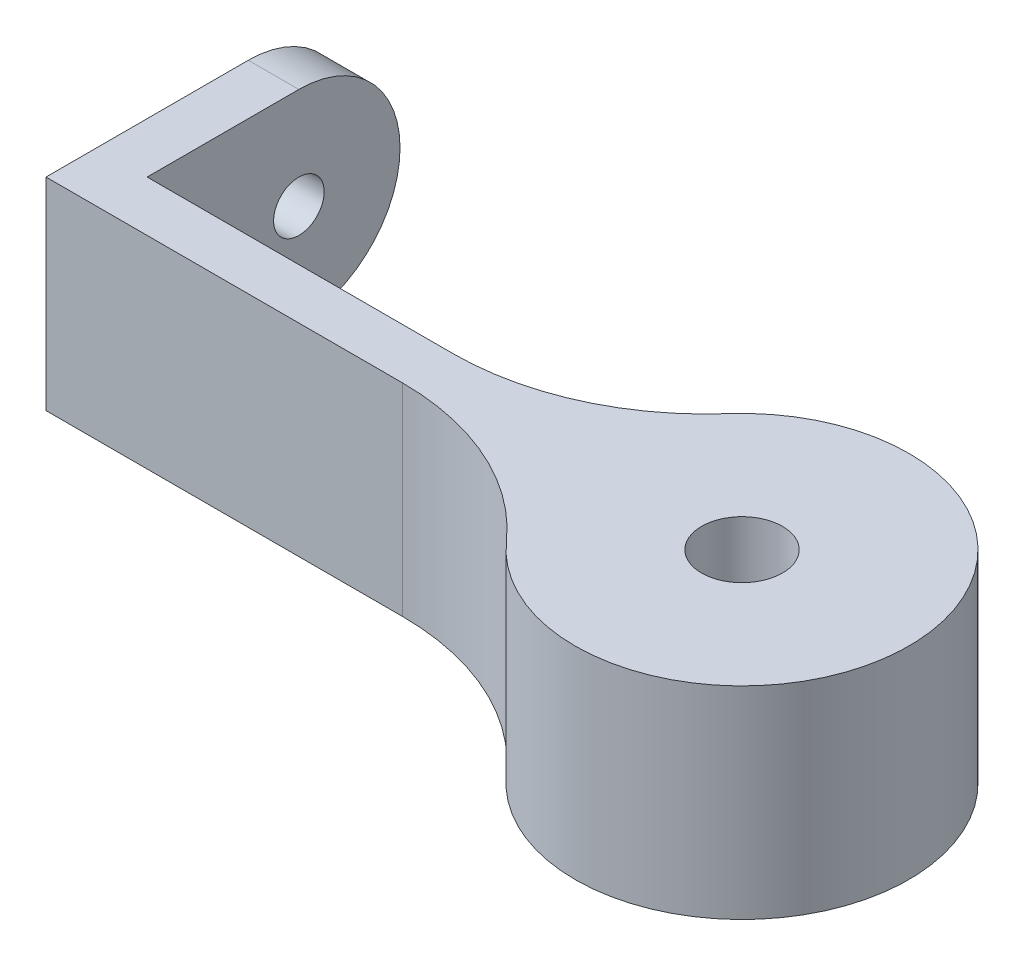
ISO-10303-21;
HEADER;
FILE_DESCRIPTION(('STEP AP214'),'2;1');
FILE_NAME('part.step','',(''),(''),'','','');
FILE_SCHEMA(('AUTOMOTIVE_DESIGN { 1 0 10303 214 1 1 1 1 }'));
ENDSEC;
DATA;
#1=APPLICATION_CONTEXT('core data for automotive mechanical design processes');
#2=APPLICATION_PROTOCOL_DEFINITION('international standard','automotive_design',2000,#1);
#3=PRODUCT_CONTEXT('',#1,'mechanical');
#4=PRODUCT('Part','Part','',(#3));
#5=PRODUCT_RELATED_PRODUCT_CATEGORY('part','',(#4));
#6=PRODUCT_DEFINITION_FORMATION('','',#4);
#7=PRODUCT_DEFINITION_CONTEXT('part definition',#1,'design');
#8=PRODUCT_DEFINITION('design','',#6,#7);
#9=PRODUCT_DEFINITION_SHAPE('','',#8);
#10=(LENGTH_UNIT() NAMED_UNIT(*) SI_UNIT(.MILLI.,.METRE.));
#11=(NAMED_UNIT(*) PLANE_ANGLE_UNIT() SI_UNIT($,.RADIAN.));
#12=(NAMED_UNIT(*) SI_UNIT($,.STERADIAN.) SOLID_ANGLE_UNIT());
#13=UNCERTAINTY_MEASURE_WITH_UNIT(LENGTH_MEASURE(1.E-05),#10,'distance_accuracy_value','');
#14=(GEOMETRIC_REPRESENTATION_CONTEXT(3) GLOBAL_UNCERTAINTY_ASSIGNED_CONTEXT((#13)) GLOBAL_UNIT_ASSIGNED_CONTEXT((#10,
#11,#12)) REPRESENTATION_CONTEXT('',''));
#15=CARTESIAN_POINT('',(0.,0.,0.));
#16=DIRECTION('',(0.,0.,1.));
#17=DIRECTION('',(1.,0.,0.));
#18=AXIS2_PLACEMENT_3D('',#15,#16,#17);
#19=CARTESIAN_POINT('',(-26.52380257212,8.,0.));
#20=DIRECTION('',(1.,0.,0.));
#21=DIRECTION('',(0.,0.,1.));
#22=AXIS2_PLACEMENT_3D('',#19,#20,#21);
#23=PLANE('',#22);
#24=CARTESIAN_POINT('',(-26.52380257212,4.,-7.));
#25=DIRECTION('',(1.,0.,0.));
#26=DIRECTION('',(0.,0.,-1.));
#27=AXIS2_PLACEMENT_3D('',#24,#25,#26);
#28=CIRCLE('',#27,1.);
#29=CARTESIAN_POINT('',(-26.52380257212,4.,-8.));
#30=VERTEX_POINT('',#29);
#31=EDGE_CURVE('E122',#30,#30,#28,.T.);
#32=ORIENTED_EDGE('',*,*,#31,.T.);
#33=EDGE_LOOP('',(#32));
#34=FACE_BOUND('',#33,.T.);
#35=DIRECTION('',(0.,0.,-1.));
#36=VECTOR('',#35,1.);
#37=CARTESIAN_POINT('',(-26.52380257212,0.,0.));
#38=LINE('',#37,#36);
#39=CARTESIAN_POINT('',(-26.52380257212,0.,0.999999999999998));
#40=VERTEX_POINT('',#39);
#41=CARTESIAN_POINT('',(-26.52380257212,0.,-7.));
#42=VERTEX_POINT('',#41);
#43=EDGE_CURVE('E119',#40,#42,#38,.T.);
#44=ORIENTED_EDGE('',*,*,#43,.F.);
#45=DIRECTION('',(0.,-1.,0.));
#46=VECTOR('',#45,1.);
#47=CARTESIAN_POINT('',(-26.52380257212,8.,0.999999999999998));
#48=LINE('',#47,#46);
#49=CARTESIAN_POINT('',(-26.52380257212,8.,0.999999999999998));
#50=VERTEX_POINT('',#49);
#51=EDGE_CURVE('E138',#50,#40,#48,.T.);
#52=ORIENTED_EDGE('',*,*,#51,.F.);
#53=DIRECTION('',(0.,0.,-1.));
#54=VECTOR('',#53,1.);
#55=CARTESIAN_POINT('',(-26.52380257212,8.,0.));
#56=LINE('',#55,#54);
#57=CARTESIAN_POINT('',(-26.52380257212,8.,-7.));
#58=VERTEX_POINT('',#57);
#59=EDGE_CURVE('E121',#50,#58,#56,.T.);
#60=ORIENTED_EDGE('',*,*,#59,.T.);
#61=CARTESIAN_POINT('',(-26.52380257212,4.,-7.));
#62=DIRECTION('',(1.,0.,0.));
#63=DIRECTION('',(0.,0.,-1.));
#64=AXIS2_PLACEMENT_3D('',#61,#62,#63);
#65=CIRCLE('',#64,4.);
#66=EDGE_CURVE('E108',#42,#58,#65,.T.);
#67=ORIENTED_EDGE('',*,*,#66,.F.);
#68=EDGE_LOOP('',(#44,#52,#60,#67));
#69=FACE_BOUND('',#68,.T.);
#70=ADVANCED_FACE('F43',(#34,#69),#23,.F.);
#71=CARTESIAN_POINT('',(-24.52380257212,8.,-1.));
#72=DIRECTION('',(1.,0.,0.));
#73=DIRECTION('',(0.,0.,1.));
#74=AXIS2_PLACEMENT_3D('',#71,#72,#73);
#75=PLANE('',#74);
#76=CARTESIAN_POINT('',(-24.52380257212,4.,-7.));
#77=DIRECTION('',(-1.,0.,0.));
#78=DIRECTION('',(0.,0.,1.));
#79=AXIS2_PLACEMENT_3D('',#76,#77,#78);
#80=CIRCLE('',#79,1.);
#81=CARTESIAN_POINT('',(-24.52380257212,4.,-8.));
#82=VERTEX_POINT('',#81);
#83=EDGE_CURVE('E151',#82,#82,#80,.F.);
#84=ORIENTED_EDGE('',*,*,#83,.F.);
#85=EDGE_LOOP('',(#84));
#86=FACE_BOUND('',#85,.T.);
#87=CARTESIAN_POINT('',(-24.52380257212,4.,-7.));
#88=DIRECTION('',(-1.,0.,0.));
#89=DIRECTION('',(0.,0.,1.));
#90=AXIS2_PLACEMENT_3D('',#87,#88,#89);
#91=CIRCLE('',#90,4.);
#92=CARTESIAN_POINT('',(-24.52380257212,0.,-7.));
#93=VERTEX_POINT('',#92);
#94=CARTESIAN_POINT('',(-24.52380257212,8.,-7.));
#95=VERTEX_POINT('',#94);
#96=EDGE_CURVE('E111',#93,#95,#91,.F.);
#97=ORIENTED_EDGE('',*,*,#96,.T.);
#98=DIRECTION('',(0.,0.,-1.));
#99=VECTOR('',#98,1.);
#100=CARTESIAN_POINT('',(-24.52380257212,8.,-1.));
#101=LINE('',#100,#99);
#102=CARTESIAN_POINT('',(-24.52380257212,8.,-1.));
#103=VERTEX_POINT('',#102);
#104=EDGE_CURVE('E145',#103,#95,#101,.T.);
#105=ORIENTED_EDGE('',*,*,#104,.F.);
#106=DIRECTION('',(0.,-1.,0.));
#107=VECTOR('',#106,1.);
#108=CARTESIAN_POINT('',(-24.52380257212,8.,-1.));
#109=LINE('',#108,#107);
#110=CARTESIAN_POINT('',(-24.52380257212,0.,-1.));
#111=VERTEX_POINT('',#110);
#112=EDGE_CURVE('E140',#103,#111,#109,.T.);
#113=ORIENTED_EDGE('',*,*,#112,.T.);
#114=DIRECTION('',(0.,0.,-1.));
#115=VECTOR('',#114,1.);
#116=CARTESIAN_POINT('',(-24.52380257212,0.,-1.));
#117=LINE('',#116,#115);
#118=EDGE_CURVE('E149',#111,#93,#117,.T.);
#119=ORIENTED_EDGE('',*,*,#118,.T.);
#120=EDGE_LOOP('',(#97,#105,#113,#119));
#121=FACE_BOUND('',#120,.T.);
#122=ADVANCED_FACE('F202',(#86,#121),#75,.T.);
#123=CARTESIAN_POINT('',(0.,8.,0.));
#124=DIRECTION('',(0.,-1.,0.));
#125=DIRECTION('',(0.,0.,1.));
#126=AXIS2_PLACEMENT_3D('',#123,#124,#125);
#127=CYLINDRICAL_SURFACE('',#126,6.6);
#128=CARTESIAN_POINT('',(0.,8.,0.));
#129=DIRECTION('',(0.,-1.,0.));
#130=DIRECTION('',(0.,0.,-1.));
#131=AXIS2_PLACEMENT_3D('',#128,#129,#130);
#132=CIRCLE('',#131,6.6);
#133=CARTESIAN_POINT('',(-4.94292933822999,8.,-4.37349397590361));
#134=VERTEX_POINT('',#133);
#135=CARTESIAN_POINT('',(-4.94292933822999,8.,4.37349397590361));
#136=VERTEX_POINT('',#135);
#137=EDGE_CURVE('E171',#134,#136,#132,.T.);
#138=ORIENTED_EDGE('',*,*,#137,.T.);
#139=DIRECTION('',(0.,-1.,0.));
#140=VECTOR('',#139,1.);
#141=CARTESIAN_POINT('',(-4.94292933822999,8.,4.37349397590361));
#142=LINE('',#141,#140);
#143=CARTESIAN_POINT('',(-4.94292933822999,0.,4.37349397590361));
#144=VERTEX_POINT('',#143);
#145=EDGE_CURVE('E144',#144,#136,#142,.F.);
#146=ORIENTED_EDGE('',*,*,#145,.F.);
#147=CARTESIAN_POINT('',(0.,0.,0.));
#148=DIRECTION('',(0.,-1.,0.));
#149=DIRECTION('',(0.,0.,-1.));
#150=AXIS2_PLACEMENT_3D('',#147,#148,#149);
#151=CIRCLE('',#150,6.6);
#152=CARTESIAN_POINT('',(-4.94292933822999,0.,-4.37349397590361));
#153=VERTEX_POINT('',#152);
#154=EDGE_CURVE('E134',#153,#144,#151,.T.);
#155=ORIENTED_EDGE('',*,*,#154,.F.);
#156=DIRECTION('',(0.,-1.,0.));
#157=VECTOR('',#156,1.);
#158=CARTESIAN_POINT('',(-4.94292933822999,8.,-4.37349397590361));
#159=LINE('',#158,#157);
#160=EDGE_CURVE('E153',#134,#153,#159,.T.);
#161=ORIENTED_EDGE('',*,*,#160,.F.);
#162=EDGE_LOOP('',(#138,#146,#155,#161));
#163=FACE_BOUND('',#162,.T.);
#164=ADVANCED_FACE('F169',(#163),#127,.T.);
#165=CARTESIAN_POINT('',(0.,8.,0.999999999999998));
#166=DIRECTION('',(0.,0.,1.));
#167=DIRECTION('',(-1.,0.,0.));
#168=AXIS2_PLACEMENT_3D('',#165,#166,#167);
#169=PLANE('',#168);
#170=DIRECTION('',(1.,0.,0.));
#171=VECTOR('',#170,1.);
#172=CARTESIAN_POINT('',(0.,8.,0.999999999999998));
#173=LINE('',#172,#171);
#174=CARTESIAN_POINT('',(-12.432216214336,8.,0.999999999999998));
#175=VERTEX_POINT('',#174);
#176=EDGE_CURVE('E173',#50,#175,#173,.T.);
#177=ORIENTED_EDGE('',*,*,#176,.F.);
#178=ORIENTED_EDGE('',*,*,#51,.T.);
#179=DIRECTION('',(1.,0.,0.));
#180=VECTOR('',#179,1.);
#181=CARTESIAN_POINT('',(0.,0.,0.999999999999998));
#182=LINE('',#181,#180);
#183=CARTESIAN_POINT('',(-12.432216214336,0.,0.999999999999998));
#184=VERTEX_POINT('',#183);
#185=EDGE_CURVE('E127',#40,#184,#182,.T.);
#186=ORIENTED_EDGE('',*,*,#185,.T.);
#187=DIRECTION('',(0.,-1.,0.));
#188=VECTOR('',#187,1.);
#189=CARTESIAN_POINT('',(-12.432216214336,8.,0.999999999999998));
#190=LINE('',#189,#188);
#191=EDGE_CURVE('E159',#175,#184,#190,.T.);
#192=ORIENTED_EDGE('',*,*,#191,.F.);
#193=EDGE_LOOP('',(#177,#178,#186,#192));
#194=FACE_BOUND('',#193,.T.);
#195=ADVANCED_FACE('F212',(#194),#169,.T.);
#196=CARTESIAN_POINT('',(0.,8.,0.));
#197=DIRECTION('',(0.,-1.,0.));
#198=DIRECTION('',(0.,0.,1.));
#199=AXIS2_PLACEMENT_3D('',#196,#197,#198);
#200=CYLINDRICAL_SURFACE('',#199,1.6);
#201=CARTESIAN_POINT('',(0.,8.,0.));
#202=DIRECTION('',(0.,-1.,0.));
#203=DIRECTION('',(0.,0.,-1.));
#204=AXIS2_PLACEMENT_3D('',#201,#202,#203);
#205=CIRCLE('',#204,1.6);
#206=CARTESIAN_POINT('',(0.,8.,-1.6));
#207=VERTEX_POINT('',#206);
#208=EDGE_CURVE('E132',#207,#207,#205,.T.);
#209=ORIENTED_EDGE('',*,*,#208,.F.);
#210=EDGE_LOOP('',(#209));
#211=FACE_BOUND('',#210,.T.);
#212=CARTESIAN_POINT('',(0.,0.,0.));
#213=DIRECTION('',(0.,-1.,0.));
#214=DIRECTION('',(0.,0.,-1.));
#215=AXIS2_PLACEMENT_3D('',#212,#213,#214);
#216=CIRCLE('',#215,1.6);
#217=CARTESIAN_POINT('',(0.,0.,-1.6));
#218=VERTEX_POINT('',#217);
#219=EDGE_CURVE('E148',#218,#218,#216,.T.);
#220=ORIENTED_EDGE('',*,*,#219,.T.);
#221=EDGE_LOOP('',(#220));
#222=FACE_BOUND('',#221,.T.);
#223=ADVANCED_FACE('F187',(#211,#222),#200,.F.);
#224=CARTESIAN_POINT('',(0.,8.,-0.999999999999999));
#225=DIRECTION('',(0.,0.,1.));
#226=DIRECTION('',(-1.,0.,0.));
#227=AXIS2_PLACEMENT_3D('',#224,#225,#226);
#228=PLANE('',#227);
#229=DIRECTION('',(1.,0.,0.));
#230=VECTOR('',#229,1.);
#231=CARTESIAN_POINT('',(0.,0.,-0.999999999999999));
#232=LINE('',#231,#230);
#233=CARTESIAN_POINT('',(-12.432216214336,0.,-1.));
#234=VERTEX_POINT('',#233);
#235=EDGE_CURVE('E129',#111,#234,#232,.T.);
#236=ORIENTED_EDGE('',*,*,#235,.F.);
#237=ORIENTED_EDGE('',*,*,#112,.F.);
#238=DIRECTION('',(1.,0.,0.));
#239=VECTOR('',#238,1.);
#240=CARTESIAN_POINT('',(0.,8.,-0.999999999999999));
#241=LINE('',#240,#239);
#242=CARTESIAN_POINT('',(-12.432216214336,8.,-1.));
#243=VERTEX_POINT('',#242);
#244=EDGE_CURVE('E141',#103,#243,#241,.T.);
#245=ORIENTED_EDGE('',*,*,#244,.T.);
#246=DIRECTION('',(0.,1.,0.));
#247=VECTOR('',#246,1.);
#248=CARTESIAN_POINT('',(-12.432216214336,8.,-1.));
#249=LINE('',#248,#247);
#250=EDGE_CURVE('E156',#234,#243,#249,.T.);
#251=ORIENTED_EDGE('',*,*,#250,.F.);
#252=EDGE_LOOP('',(#236,#237,#245,#251));
#253=FACE_BOUND('',#252,.T.);
#254=ADVANCED_FACE('F198',(#253),#228,.F.);
#255=CARTESIAN_POINT('',(0.,8.,0.));
#256=DIRECTION('',(0.,1.,0.));
#257=DIRECTION('',(0.,0.,-1.));
#258=AXIS2_PLACEMENT_3D('',#255,#256,#257);
#259=PLANE('',#258);
#260=DIRECTION('',(-1.,0.,0.));
#261=VECTOR('',#260,1.);
#262=CARTESIAN_POINT('',(-18.8669483226277,8.,-7.));
#263=LINE('',#262,#261);
#264=EDGE_CURVE('E123',#95,#58,#263,.T.);
#265=ORIENTED_EDGE('',*,*,#264,.T.);
#266=ORIENTED_EDGE('',*,*,#59,.F.);
#267=ORIENTED_EDGE('',*,*,#176,.T.);
#268=CARTESIAN_POINT('',(-12.432216214336,8.,11.));
#269=DIRECTION('',(0.,-1.,0.));
#270=DIRECTION('',(0.,0.,-1.));
#271=AXIS2_PLACEMENT_3D('',#268,#269,#270);
#272=CIRCLE('',#271,10.);
#273=EDGE_CURVE('E11',#136,#175,#272,.F.);
#274=ORIENTED_EDGE('',*,*,#273,.F.);
#275=ORIENTED_EDGE('',*,*,#137,.F.);
#276=CARTESIAN_POINT('',(-12.432216214336,8.,-11.));
#277=DIRECTION('',(0.,-1.,0.));
#278=DIRECTION('',(0.,0.,-1.));
#279=AXIS2_PLACEMENT_3D('',#276,#277,#278);
#280=CIRCLE('',#279,10.);
#281=EDGE_CURVE('E163',#243,#134,#280,.F.);
#282=ORIENTED_EDGE('',*,*,#281,.F.);
#283=ORIENTED_EDGE('',*,*,#244,.F.);
#284=ORIENTED_EDGE('',*,*,#104,.T.);
#285=EDGE_LOOP('',(#265,#266,#267,#274,#275,#282,#283,#284));
#286=FACE_BOUND('',#285,.T.);
#287=ORIENTED_EDGE('',*,*,#208,.T.);
#288=EDGE_LOOP('',(#287));
#289=FACE_BOUND('',#288,.T.);
#290=ADVANCED_FACE('F191',(#286,#289),#259,.T.);
#291=CARTESIAN_POINT('',(0.,0.,0.));
#292=DIRECTION('',(0.,1.,0.));
#293=DIRECTION('',(0.,0.,-1.));
#294=AXIS2_PLACEMENT_3D('',#291,#292,#293);
#295=PLANE('',#294);
#296=ORIENTED_EDGE('',*,*,#219,.F.);
#297=EDGE_LOOP('',(#296));
#298=FACE_BOUND('',#297,.T.);
#299=ORIENTED_EDGE('',*,*,#118,.F.);
#300=ORIENTED_EDGE('',*,*,#235,.T.);
#301=CARTESIAN_POINT('',(-12.432216214336,0.,-11.));
#302=DIRECTION('',(0.,-1.,0.));
#303=DIRECTION('',(0.,0.,-1.));
#304=AXIS2_PLACEMENT_3D('',#301,#302,#303);
#305=CIRCLE('',#304,10.);
#306=EDGE_CURVE('E161',#153,#234,#305,.T.);
#307=ORIENTED_EDGE('',*,*,#306,.F.);
#308=ORIENTED_EDGE('',*,*,#154,.T.);
#309=CARTESIAN_POINT('',(-12.432216214336,0.,11.));
#310=DIRECTION('',(0.,-1.,0.));
#311=DIRECTION('',(0.,0.,-1.));
#312=AXIS2_PLACEMENT_3D('',#309,#310,#311);
#313=CIRCLE('',#312,10.);
#314=EDGE_CURVE('E51',#184,#144,#313,.T.);
#315=ORIENTED_EDGE('',*,*,#314,.F.);
#316=ORIENTED_EDGE('',*,*,#185,.F.);
#317=ORIENTED_EDGE('',*,*,#43,.T.);
#318=DIRECTION('',(-1.,0.,0.));
#319=VECTOR('',#318,1.);
#320=CARTESIAN_POINT('',(-18.8669483226277,0.,-7.));
#321=LINE('',#320,#319);
#322=EDGE_CURVE('E105',#93,#42,#321,.T.);
#323=ORIENTED_EDGE('',*,*,#322,.F.);
#324=EDGE_LOOP('',(#299,#300,#307,#308,#315,#316,#317,#323));
#325=FACE_BOUND('',#324,.T.);
#326=ADVANCED_FACE('F125',(#298,#325),#295,.F.);
#327=CARTESIAN_POINT('',(-12.432216214336,8.,-11.));
#328=DIRECTION('',(0.,-1.,0.));
#329=DIRECTION('',(0.,0.,1.));
#330=AXIS2_PLACEMENT_3D('',#327,#328,#329);
#331=CYLINDRICAL_SURFACE('',#330,10.);
#332=ORIENTED_EDGE('',*,*,#281,.T.);
#333=ORIENTED_EDGE('',*,*,#160,.T.);
#334=ORIENTED_EDGE('',*,*,#306,.T.);
#335=ORIENTED_EDGE('',*,*,#250,.T.);
#336=EDGE_LOOP('',(#332,#333,#334,#335));
#337=FACE_BOUND('',#336,.T.);
#338=ADVANCED_FACE('F190',(#337),#331,.F.);
#339=CARTESIAN_POINT('',(-12.432216214336,8.,11.));
#340=DIRECTION('',(0.,-1.,0.));
#341=DIRECTION('',(0.,0.,1.));
#342=AXIS2_PLACEMENT_3D('',#339,#340,#341);
#343=CYLINDRICAL_SURFACE('',#342,10.);
#344=ORIENTED_EDGE('',*,*,#273,.T.);
#345=ORIENTED_EDGE('',*,*,#191,.T.);
#346=ORIENTED_EDGE('',*,*,#314,.T.);
#347=ORIENTED_EDGE('',*,*,#145,.T.);
#348=EDGE_LOOP('',(#344,#345,#346,#347));
#349=FACE_BOUND('',#348,.T.);
#350=ADVANCED_FACE('F45',(#349),#343,.F.);
#351=CARTESIAN_POINT('',(-18.8669483226277,4.,-7.));
#352=DIRECTION('',(-1.,0.,0.));
#353=DIRECTION('',(0.,0.,-1.));
#354=AXIS2_PLACEMENT_3D('',#351,#352,#353);
#355=CYLINDRICAL_SURFACE('',#354,4.);
#356=ORIENTED_EDGE('',*,*,#96,.F.);
#357=ORIENTED_EDGE('',*,*,#322,.T.);
#358=ORIENTED_EDGE('',*,*,#66,.T.);
#359=ORIENTED_EDGE('',*,*,#264,.F.);
#360=EDGE_LOOP('',(#356,#357,#358,#359));
#361=FACE_BOUND('',#360,.T.);
#362=ADVANCED_FACE('F107',(#361),#355,.T.);
#363=CARTESIAN_POINT('',(-18.8669483226277,4.,-7.));
#364=DIRECTION('',(-1.,0.,0.));
#365=DIRECTION('',(0.,0.,-1.));
#366=AXIS2_PLACEMENT_3D('',#363,#364,#365);
#367=CYLINDRICAL_SURFACE('',#366,1.);
#368=CARTESIAN_POINT('',(-26.52380257212,4.,-8.));
#369=CARTESIAN_POINT('',(-26.5029692387867,4.,-8.));
#370=CARTESIAN_POINT('',(-26.4821359054534,4.,-8.));
#371=CARTESIAN_POINT('',(-26.4404692387867,4.,-8.));
#372=CARTESIAN_POINT('',(-26.4196359054534,4.,-8.));
#373=CARTESIAN_POINT('',(-26.3779692387867,4.,-8.));
#374=CARTESIAN_POINT('',(-26.3571359054534,4.,-8.));
#375=CARTESIAN_POINT('',(-26.3154692387867,4.,-8.));
#376=CARTESIAN_POINT('',(-26.2946359054534,4.,-8.));
#377=CARTESIAN_POINT('',(-26.2529692387867,4.,-8.));
#378=CARTESIAN_POINT('',(-26.2321359054534,4.,-8.));
#379=CARTESIAN_POINT('',(-26.1904692387867,4.,-8.));
#380=CARTESIAN_POINT('',(-26.1696359054534,4.,-8.));
#381=CARTESIAN_POINT('',(-26.1279692387867,4.,-8.));
#382=CARTESIAN_POINT('',(-26.1071359054534,4.,-8.));
#383=CARTESIAN_POINT('',(-26.0654692387867,4.,-8.));
#384=CARTESIAN_POINT('',(-26.0446359054534,4.,-8.));
#385=CARTESIAN_POINT('',(-26.0029692387867,4.,-8.));
#386=CARTESIAN_POINT('',(-25.9821359054534,4.,-8.));
#387=CARTESIAN_POINT('',(-25.9404692387867,4.,-8.));
#388=CARTESIAN_POINT('',(-25.9196359054534,4.,-8.));
#389=CARTESIAN_POINT('',(-25.8779692387867,4.,-8.));
#390=CARTESIAN_POINT('',(-25.8571359054534,4.,-8.));
#391=CARTESIAN_POINT('',(-25.8154692387867,4.,-8.));
#392=CARTESIAN_POINT('',(-25.7946359054534,4.,-8.));
#393=CARTESIAN_POINT('',(-25.7529692387867,4.,-8.));
#394=CARTESIAN_POINT('',(-25.7321359054534,4.,-8.));
#395=CARTESIAN_POINT('',(-25.6904692387867,4.,-8.));
#396=CARTESIAN_POINT('',(-25.6696359054534,4.,-8.));
#397=CARTESIAN_POINT('',(-25.6279692387867,4.,-8.));
#398=CARTESIAN_POINT('',(-25.6071359054534,4.,-8.));
#399=CARTESIAN_POINT('',(-25.5654692387867,4.,-8.));
#400=CARTESIAN_POINT('',(-25.5446359054534,4.,-8.));
#401=CARTESIAN_POINT('',(-25.5029692387867,4.,-8.));
#402=CARTESIAN_POINT('',(-25.4821359054534,4.,-8.));
#403=CARTESIAN_POINT('',(-25.4404692387867,4.,-8.));
#404=CARTESIAN_POINT('',(-25.4196359054534,4.,-8.));
#405=CARTESIAN_POINT('',(-25.3779692387867,4.,-8.));
#406=CARTESIAN_POINT('',(-25.3571359054534,4.,-8.));
#407=CARTESIAN_POINT('',(-25.3154692387867,4.,-8.));
#408=CARTESIAN_POINT('',(-25.2946359054534,4.,-8.));
#409=CARTESIAN_POINT('',(-25.2529692387867,4.,-8.));
#410=CARTESIAN_POINT('',(-25.2321359054534,4.,-8.));
#411=CARTESIAN_POINT('',(-25.1904692387867,4.,-8.));
#412=CARTESIAN_POINT('',(-25.1696359054534,4.,-8.));
#413=CARTESIAN_POINT('',(-25.1279692387867,4.,-8.));
#414=CARTESIAN_POINT('',(-25.1071359054534,4.,-8.));
#415=CARTESIAN_POINT('',(-25.0654692387867,4.,-8.));
#416=CARTESIAN_POINT('',(-25.0446359054534,4.,-8.));
#417=CARTESIAN_POINT('',(-25.0029692387867,4.,-8.));
#418=CARTESIAN_POINT('',(-24.9821359054534,4.,-8.));
#419=CARTESIAN_POINT('',(-24.9404692387867,4.,-8.));
#420=CARTESIAN_POINT('',(-24.9196359054534,4.,-8.));
#421=CARTESIAN_POINT('',(-24.8779692387867,4.,-8.));
#422=CARTESIAN_POINT('',(-24.8571359054534,4.,-8.));
#423=CARTESIAN_POINT('',(-24.8154692387867,4.,-8.));
#424=CARTESIAN_POINT('',(-24.7946359054534,4.,-8.));
#425=CARTESIAN_POINT('',(-24.7529692387867,4.,-8.));
#426=CARTESIAN_POINT('',(-24.7321359054534,4.,-8.));
#427=CARTESIAN_POINT('',(-24.6904692387867,4.,-8.));
#428=CARTESIAN_POINT('',(-24.6696359054534,4.,-8.));
#429=CARTESIAN_POINT('',(-24.6279692387867,4.,-8.));
#430=CARTESIAN_POINT('',(-24.6071359054534,4.,-8.));
#431=CARTESIAN_POINT('',(-24.5654692387867,4.,-8.));
#432=CARTESIAN_POINT('',(-24.5446359054534,4.,-8.));
#433=CARTESIAN_POINT('',(-24.52380257212,4.,-8.));
#434=B_SPLINE_CURVE_WITH_KNOTS('',3,(#368,#369,#370,#371,#372,#373,#374,#375,#376,#377,#378,
#379,#380,#381,#382,#383,#384,#385,#386,#387,#388,#389,#390,#391,#392,#393,#394,#395,#396,#397,
#398,#399,#400,#401,#402,#403,#404,#405,#406,#407,#408,#409,#410,#411,#412,#413,#414,#415,#416,
#417,#418,#419,#420,#421,#422,#423,#424,#425,#426,#427,#428,#429,#430,#431,#432,#433),
.UNSPECIFIED.,.F.,.F.,(4,2,2,2,2,2,2,2,2,2,2,2,2,2,2,2,2,2,2,2,2,2,2,2,2,2,2,2,2,2,2,2,4),(0.,
0.0625000000000001,0.125,0.187500000000004,0.250000000000004,0.312500000000004,
0.375000000000004,0.437500000000004,0.500000000000004,0.562500000000004,0.625000000000004,
0.687500000000004,0.750000000000004,0.812500000000004,0.875000000000004,0.937500000000004,1.,
1.0625,1.125,1.1875,1.25,1.3125,1.375,1.4375,1.5,1.5625,1.625,1.6875,1.75000000000001,
1.81250000000001,1.87500000000001,1.93750000000001,2.00000000000001),.UNSPECIFIED.);
#435=EDGE_CURVE('BSEAM238',#30,#82,#434,.T.);
#436=ORIENTED_EDGE('',*,*,#31,.F.);
#437=ORIENTED_EDGE('',*,*,#83,.T.);
#438=ORIENTED_EDGE('',*,*,#435,.T.);
#439=ORIENTED_EDGE('',*,*,#435,.F.);
#440=EDGE_LOOP('',(#436,#438,#437,#439));
#441=FACE_BOUND('',#440,.T.);
#442=ADVANCED_FACE('F238',(#441),#367,.F.);
#443=CLOSED_SHELL('',(#70,#122,#164,#195,#223,#254,#290,#326,#338,#350,#362,#442));
#444=MANIFOLD_SOLID_BREP('B2',#443);
#445=ADVANCED_BREP_SHAPE_REPRESENTATION('',(#18,#444),#14);
#446=SHAPE_DEFINITION_REPRESENTATION(#9,#445);
ENDSEC;
END-ISO-10303-21;
